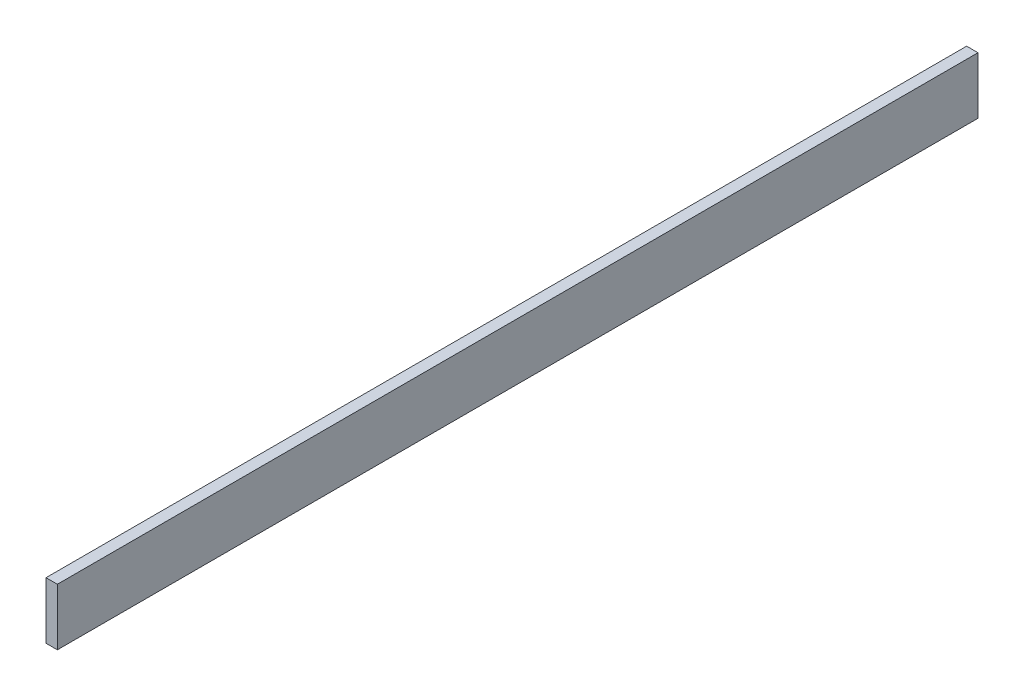
ISO-10303-21;
HEADER;
FILE_DESCRIPTION(('STEP AP214'),'2;1');
FILE_NAME('part.step','',(''),(''),'','','');
FILE_SCHEMA(('AUTOMOTIVE_DESIGN { 1 0 10303 214 1 1 1 1 }'));
ENDSEC;
DATA;
#1=APPLICATION_CONTEXT('core data for automotive mechanical design processes');
#2=APPLICATION_PROTOCOL_DEFINITION('international standard','automotive_design',2000,#1);
#3=PRODUCT_CONTEXT('',#1,'mechanical');
#4=PRODUCT('Part','Part','',(#3));
#5=PRODUCT_RELATED_PRODUCT_CATEGORY('part','',(#4));
#6=PRODUCT_DEFINITION_FORMATION('','',#4);
#7=PRODUCT_DEFINITION_CONTEXT('part definition',#1,'design');
#8=PRODUCT_DEFINITION('design','',#6,#7);
#9=PRODUCT_DEFINITION_SHAPE('','',#8);
#10=(LENGTH_UNIT() NAMED_UNIT(*) SI_UNIT(.MILLI.,.METRE.));
#11=(NAMED_UNIT(*) PLANE_ANGLE_UNIT() SI_UNIT($,.RADIAN.));
#12=(NAMED_UNIT(*) SI_UNIT($,.STERADIAN.) SOLID_ANGLE_UNIT());
#13=UNCERTAINTY_MEASURE_WITH_UNIT(LENGTH_MEASURE(1.E-05),#10,'distance_accuracy_value','');
#14=(GEOMETRIC_REPRESENTATION_CONTEXT(3) GLOBAL_UNCERTAINTY_ASSIGNED_CONTEXT((#13)) GLOBAL_UNIT_ASSIGNED_CONTEXT((#10,
#11,#12)) REPRESENTATION_CONTEXT('',''));
#15=CARTESIAN_POINT('',(0.,0.,0.));
#16=DIRECTION('',(0.,0.,1.));
#17=DIRECTION('',(1.,0.,0.));
#18=AXIS2_PLACEMENT_3D('',#15,#16,#17);
#19=CARTESIAN_POINT('',(281.,-50.,81.035636223129));
#20=DIRECTION('',(0.,0.,-1.));
#21=DIRECTION('',(-1.,0.,0.));
#22=AXIS2_PLACEMENT_3D('',#19,#20,#21);
#23=PLANE('',#22);
#24=DIRECTION('',(0.,-1.,0.));
#25=VECTOR('',#24,1.);
#26=CARTESIAN_POINT('',(280.,-50.,81.035636223129));
#27=LINE('',#26,#25);
#28=CARTESIAN_POINT('',(280.,-45.,81.035636223129));
#29=VERTEX_POINT('',#28);
#30=CARTESIAN_POINT('',(280.,-50.,81.035636223129));
#31=VERTEX_POINT('',#30);
#32=EDGE_CURVE('E101',#29,#31,#27,.T.);
#33=ORIENTED_EDGE('',*,*,#32,.T.);
#34=DIRECTION('',(-1.,0.,0.));
#35=VECTOR('',#34,1.);
#36=CARTESIAN_POINT('',(281.,-50.,81.035636223129));
#37=LINE('',#36,#35);
#38=CARTESIAN_POINT('',(281.,-50.,81.035636223129));
#39=VERTEX_POINT('',#38);
#40=EDGE_CURVE('E11',#39,#31,#37,.T.);
#41=ORIENTED_EDGE('',*,*,#40,.F.);
#42=DIRECTION('',(0.,-1.,0.));
#43=VECTOR('',#42,1.);
#44=CARTESIAN_POINT('',(281.,-50.,81.035636223129));
#45=LINE('',#44,#43);
#46=CARTESIAN_POINT('',(281.,-45.,81.035636223129));
#47=VERTEX_POINT('',#46);
#48=EDGE_CURVE('E89',#47,#39,#45,.T.);
#49=ORIENTED_EDGE('',*,*,#48,.F.);
#50=DIRECTION('',(-1.,0.,0.));
#51=VECTOR('',#50,1.);
#52=CARTESIAN_POINT('',(281.,-45.,81.035636223129));
#53=LINE('',#52,#51);
#54=EDGE_CURVE('E97',#47,#29,#53,.T.);
#55=ORIENTED_EDGE('',*,*,#54,.T.);
#56=EDGE_LOOP('',(#33,#41,#49,#55));
#57=FACE_BOUND('',#56,.T.);
#58=ADVANCED_FACE('F38',(#57),#23,.F.);
#59=CARTESIAN_POINT('',(281.,-50.,81.035636223129));
#60=DIRECTION('',(0.,1.,0.));
#61=DIRECTION('',(0.,0.,1.));
#62=AXIS2_PLACEMENT_3D('',#59,#60,#61);
#63=PLANE('',#62);
#64=DIRECTION('',(0.,0.,-1.));
#65=VECTOR('',#64,1.);
#66=CARTESIAN_POINT('',(280.,-50.,81.035636223129));
#67=LINE('',#66,#65);
#68=CARTESIAN_POINT('',(280.,-50.,0.));
#69=VERTEX_POINT('',#68);
#70=EDGE_CURVE('E93',#31,#69,#67,.T.);
#71=ORIENTED_EDGE('',*,*,#70,.T.);
#72=DIRECTION('',(-1.,0.,0.));
#73=VECTOR('',#72,1.);
#74=CARTESIAN_POINT('',(281.,-50.,0.));
#75=LINE('',#74,#73);
#76=CARTESIAN_POINT('',(281.,-50.,0.));
#77=VERTEX_POINT('',#76);
#78=EDGE_CURVE('E46',#77,#69,#75,.T.);
#79=ORIENTED_EDGE('',*,*,#78,.F.);
#80=DIRECTION('',(0.,0.,-1.));
#81=VECTOR('',#80,1.);
#82=CARTESIAN_POINT('',(281.,-50.,81.035636223129));
#83=LINE('',#82,#81);
#84=EDGE_CURVE('E84',#39,#77,#83,.T.);
#85=ORIENTED_EDGE('',*,*,#84,.F.);
#86=ORIENTED_EDGE('',*,*,#40,.T.);
#87=EDGE_LOOP('',(#71,#79,#85,#86));
#88=FACE_BOUND('',#87,.T.);
#89=ADVANCED_FACE('F92',(#88),#63,.F.);
#90=CARTESIAN_POINT('',(281.,-50.,0.));
#91=DIRECTION('',(0.,0.,1.));
#92=DIRECTION('',(1.,0.,0.));
#93=AXIS2_PLACEMENT_3D('',#90,#91,#92);
#94=PLANE('',#93);
#95=DIRECTION('',(0.,1.,0.));
#96=VECTOR('',#95,1.);
#97=CARTESIAN_POINT('',(280.,-50.,0.));
#98=LINE('',#97,#96);
#99=CARTESIAN_POINT('',(280.,-45.,0.));
#100=VERTEX_POINT('',#99);
#101=EDGE_CURVE('E71',#69,#100,#98,.T.);
#102=ORIENTED_EDGE('',*,*,#101,.T.);
#103=DIRECTION('',(-1.,0.,0.));
#104=VECTOR('',#103,1.);
#105=CARTESIAN_POINT('',(281.,-45.,0.));
#106=LINE('',#105,#104);
#107=CARTESIAN_POINT('',(281.,-45.,0.));
#108=VERTEX_POINT('',#107);
#109=EDGE_CURVE('E94',#108,#100,#106,.T.);
#110=ORIENTED_EDGE('',*,*,#109,.F.);
#111=DIRECTION('',(0.,1.,0.));
#112=VECTOR('',#111,1.);
#113=CARTESIAN_POINT('',(281.,-50.,0.));
#114=LINE('',#113,#112);
#115=EDGE_CURVE('E87',#77,#108,#114,.T.);
#116=ORIENTED_EDGE('',*,*,#115,.F.);
#117=ORIENTED_EDGE('',*,*,#78,.T.);
#118=EDGE_LOOP('',(#102,#110,#116,#117));
#119=FACE_BOUND('',#118,.T.);
#120=ADVANCED_FACE('F95',(#119),#94,.F.);
#121=CARTESIAN_POINT('',(281.,-45.,81.035636223129));
#122=DIRECTION('',(0.,-1.,0.));
#123=DIRECTION('',(0.,0.,-1.));
#124=AXIS2_PLACEMENT_3D('',#121,#122,#123);
#125=PLANE('',#124);
#126=DIRECTION('',(0.,0.,1.));
#127=VECTOR('',#126,1.);
#128=CARTESIAN_POINT('',(280.,-45.,81.035636223129));
#129=LINE('',#128,#127);
#130=EDGE_CURVE('E77',#100,#29,#129,.T.);
#131=ORIENTED_EDGE('',*,*,#130,.T.);
#132=ORIENTED_EDGE('',*,*,#54,.F.);
#133=DIRECTION('',(0.,0.,1.));
#134=VECTOR('',#133,1.);
#135=CARTESIAN_POINT('',(281.,-45.,81.035636223129));
#136=LINE('',#135,#134);
#137=EDGE_CURVE('E54',#108,#47,#136,.T.);
#138=ORIENTED_EDGE('',*,*,#137,.F.);
#139=ORIENTED_EDGE('',*,*,#109,.T.);
#140=EDGE_LOOP('',(#131,#132,#138,#139));
#141=FACE_BOUND('',#140,.T.);
#142=ADVANCED_FACE('F108',(#141),#125,.F.);
#143=CARTESIAN_POINT('',(281.,0.,0.));
#144=DIRECTION('',(-1.,0.,0.));
#145=DIRECTION('',(0.,0.,1.));
#146=AXIS2_PLACEMENT_3D('',#143,#144,#145);
#147=PLANE('',#146);
#148=ORIENTED_EDGE('',*,*,#48,.T.);
#149=ORIENTED_EDGE('',*,*,#84,.T.);
#150=ORIENTED_EDGE('',*,*,#115,.T.);
#151=ORIENTED_EDGE('',*,*,#137,.T.);
#152=EDGE_LOOP('',(#148,#149,#150,#151));
#153=FACE_BOUND('',#152,.T.);
#154=ADVANCED_FACE('F85',(#153),#147,.F.);
#155=CARTESIAN_POINT('',(280.,0.,0.));
#156=DIRECTION('',(-1.,0.,0.));
#157=DIRECTION('',(0.,0.,1.));
#158=AXIS2_PLACEMENT_3D('',#155,#156,#157);
#159=PLANE('',#158);
#160=ORIENTED_EDGE('',*,*,#32,.F.);
#161=ORIENTED_EDGE('',*,*,#130,.F.);
#162=ORIENTED_EDGE('',*,*,#101,.F.);
#163=ORIENTED_EDGE('',*,*,#70,.F.);
#164=EDGE_LOOP('',(#160,#161,#162,#163));
#165=FACE_BOUND('',#164,.T.);
#166=ADVANCED_FACE('F111',(#165),#159,.T.);
#167=CLOSED_SHELL('',(#58,#89,#120,#142,#154,#166));
#168=MANIFOLD_SOLID_BREP('B2',#167);
#169=ADVANCED_BREP_SHAPE_REPRESENTATION('',(#18,#168),#14);
#170=SHAPE_DEFINITION_REPRESENTATION(#9,#169);
ENDSEC;
END-ISO-10303-21;
